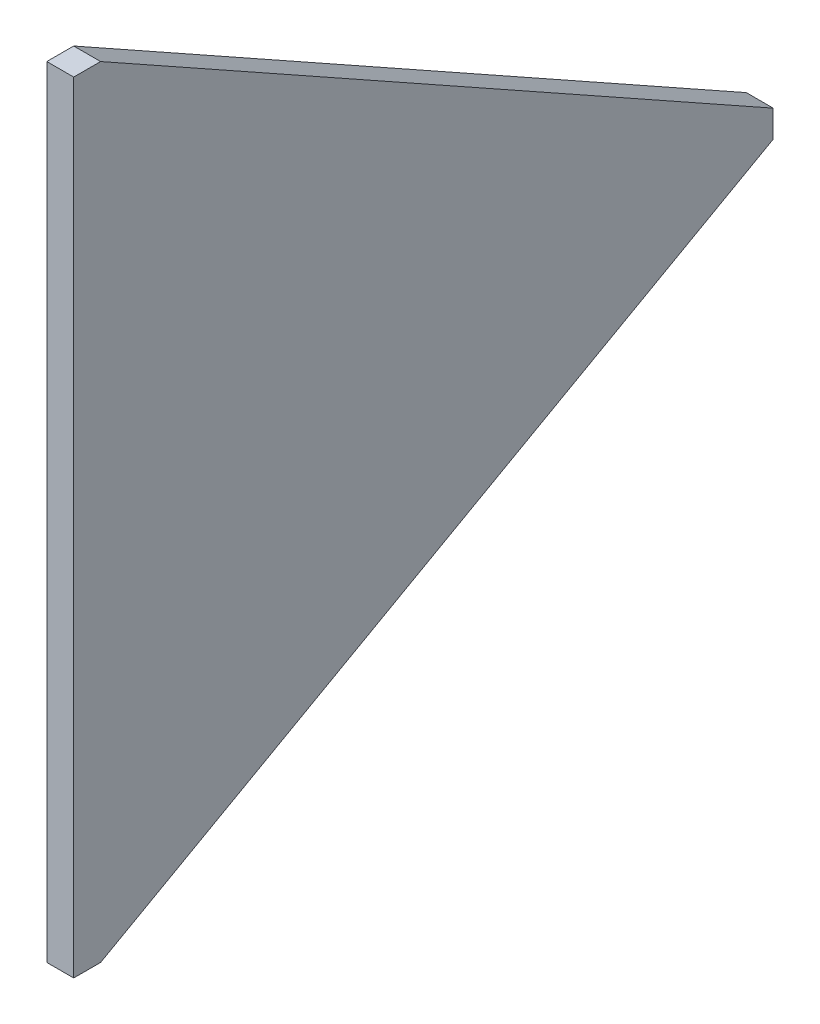
ISO-10303-21;
HEADER;
FILE_DESCRIPTION(('STEP AP214'),'2;1');
FILE_NAME('part.step','',(''),(''),'','','');
FILE_SCHEMA(('AUTOMOTIVE_DESIGN { 1 0 10303 214 1 1 1 1 }'));
ENDSEC;
DATA;
#1=APPLICATION_CONTEXT('core data for automotive mechanical design processes');
#2=APPLICATION_PROTOCOL_DEFINITION('international standard','automotive_design',2000,#1);
#3=PRODUCT_CONTEXT('',#1,'mechanical');
#4=PRODUCT('Part','Part','',(#3));
#5=PRODUCT_RELATED_PRODUCT_CATEGORY('part','',(#4));
#6=PRODUCT_DEFINITION_FORMATION('','',#4);
#7=PRODUCT_DEFINITION_CONTEXT('part definition',#1,'design');
#8=PRODUCT_DEFINITION('design','',#6,#7);
#9=PRODUCT_DEFINITION_SHAPE('','',#8);
#10=(LENGTH_UNIT() NAMED_UNIT(*) SI_UNIT(.MILLI.,.METRE.));
#11=(NAMED_UNIT(*) PLANE_ANGLE_UNIT() SI_UNIT($,.RADIAN.));
#12=(NAMED_UNIT(*) SI_UNIT($,.STERADIAN.) SOLID_ANGLE_UNIT());
#13=UNCERTAINTY_MEASURE_WITH_UNIT(LENGTH_MEASURE(1.E-05),#10,'distance_accuracy_value','');
#14=(GEOMETRIC_REPRESENTATION_CONTEXT(3) GLOBAL_UNCERTAINTY_ASSIGNED_CONTEXT((#13)) GLOBAL_UNIT_ASSIGNED_CONTEXT((#10,
#11,#12)) REPRESENTATION_CONTEXT('',''));
#15=CARTESIAN_POINT('',(0.,0.,0.));
#16=DIRECTION('',(0.,0.,1.));
#17=DIRECTION('',(1.,0.,0.));
#18=AXIS2_PLACEMENT_3D('',#15,#16,#17);
#19=CARTESIAN_POINT('',(2.,-29.,0.));
#20=DIRECTION('',(0.,1.,0.));
#21=DIRECTION('',(0.,0.,1.));
#22=AXIS2_PLACEMENT_3D('',#19,#20,#21);
#23=PLANE('',#22);
#24=DIRECTION('',(0.,0.,-1.));
#25=VECTOR('',#24,1.);
#26=CARTESIAN_POINT('',(0.,-29.,0.));
#27=LINE('',#26,#25);
#28=CARTESIAN_POINT('',(0.,-29.,0.));
#29=VERTEX_POINT('',#28);
#30=CARTESIAN_POINT('',(0.,-29.,-2.00000000000001));
#31=VERTEX_POINT('',#30);
#32=EDGE_CURVE('E128',#29,#31,#27,.T.);
#33=ORIENTED_EDGE('',*,*,#32,.T.);
#34=DIRECTION('',(-1.,0.,0.));
#35=VECTOR('',#34,1.);
#36=CARTESIAN_POINT('',(2.,-29.,-2.00000000000001));
#37=LINE('',#36,#35);
#38=CARTESIAN_POINT('',(2.,-29.,-2.00000000000001));
#39=VERTEX_POINT('',#38);
#40=EDGE_CURVE('E11',#39,#31,#37,.T.);
#41=ORIENTED_EDGE('',*,*,#40,.F.);
#42=DIRECTION('',(0.,0.,-1.));
#43=VECTOR('',#42,1.);
#44=CARTESIAN_POINT('',(2.,-29.,0.));
#45=LINE('',#44,#43);
#46=CARTESIAN_POINT('',(2.,-29.,0.));
#47=VERTEX_POINT('',#46);
#48=EDGE_CURVE('E144',#47,#39,#45,.T.);
#49=ORIENTED_EDGE('',*,*,#48,.F.);
#50=DIRECTION('',(-1.,0.,0.));
#51=VECTOR('',#50,1.);
#52=CARTESIAN_POINT('',(2.,-29.,0.));
#53=LINE('',#52,#51);
#54=EDGE_CURVE('E124',#47,#29,#53,.T.);
#55=ORIENTED_EDGE('',*,*,#54,.T.);
#56=EDGE_LOOP('',(#33,#41,#49,#55));
#57=FACE_BOUND('',#56,.T.);
#58=ADVANCED_FACE('F39',(#57),#23,.F.);
#59=CARTESIAN_POINT('',(2.,-29.,-2.00000000000001));
#60=DIRECTION('',(0.,0.87250601594972,0.488603368931843));
#61=DIRECTION('',(0.,-0.488603368931843,0.87250601594972));
#62=AXIS2_PLACEMENT_3D('',#59,#60,#61);
#63=PLANE('',#62);
#64=DIRECTION('',(0.,0.488603368931843,-0.87250601594972));
#65=VECTOR('',#64,1.);
#66=CARTESIAN_POINT('',(0.,-29.,-2.00000000000001));
#67=LINE('',#66,#65);
#68=CARTESIAN_POINT('',(0.,-1.,-52.));
#69=VERTEX_POINT('',#68);
#70=EDGE_CURVE('E132',#31,#69,#67,.T.);
#71=ORIENTED_EDGE('',*,*,#70,.T.);
#72=DIRECTION('',(-1.,0.,0.));
#73=VECTOR('',#72,1.);
#74=CARTESIAN_POINT('',(2.,-1.,-52.));
#75=LINE('',#74,#73);
#76=CARTESIAN_POINT('',(2.,-1.,-52.));
#77=VERTEX_POINT('',#76);
#78=EDGE_CURVE('E48',#77,#69,#75,.T.);
#79=ORIENTED_EDGE('',*,*,#78,.F.);
#80=DIRECTION('',(0.,0.488603368931843,-0.87250601594972));
#81=VECTOR('',#80,1.);
#82=CARTESIAN_POINT('',(2.,-29.,-2.00000000000001));
#83=LINE('',#82,#81);
#84=EDGE_CURVE('E93',#39,#77,#83,.T.);
#85=ORIENTED_EDGE('',*,*,#84,.F.);
#86=ORIENTED_EDGE('',*,*,#40,.T.);
#87=EDGE_LOOP('',(#71,#79,#85,#86));
#88=FACE_BOUND('',#87,.T.);
#89=ADVANCED_FACE('F172',(#88),#63,.F.);
#90=CARTESIAN_POINT('',(2.,-1.,-52.));
#91=DIRECTION('',(0.,0.,1.));
#92=DIRECTION('',(1.,0.,0.));
#93=AXIS2_PLACEMENT_3D('',#90,#91,#92);
#94=PLANE('',#93);
#95=DIRECTION('',(0.,1.,0.));
#96=VECTOR('',#95,1.);
#97=CARTESIAN_POINT('',(0.,-1.,-52.));
#98=LINE('',#97,#96);
#99=CARTESIAN_POINT('',(0.,1.,-52.));
#100=VERTEX_POINT('',#99);
#101=EDGE_CURVE('E135',#69,#100,#98,.T.);
#102=ORIENTED_EDGE('',*,*,#101,.T.);
#103=DIRECTION('',(-1.,0.,0.));
#104=VECTOR('',#103,1.);
#105=CARTESIAN_POINT('',(2.,1.,-52.));
#106=LINE('',#105,#104);
#107=CARTESIAN_POINT('',(2.,1.,-52.));
#108=VERTEX_POINT('',#107);
#109=EDGE_CURVE('E117',#108,#100,#106,.T.);
#110=ORIENTED_EDGE('',*,*,#109,.F.);
#111=DIRECTION('',(0.,1.,0.));
#112=VECTOR('',#111,1.);
#113=CARTESIAN_POINT('',(2.,-1.,-52.));
#114=LINE('',#113,#112);
#115=EDGE_CURVE('E106',#77,#108,#114,.T.);
#116=ORIENTED_EDGE('',*,*,#115,.F.);
#117=ORIENTED_EDGE('',*,*,#78,.T.);
#118=EDGE_LOOP('',(#102,#110,#116,#117));
#119=FACE_BOUND('',#118,.T.);
#120=ADVANCED_FACE('F154',(#119),#94,.F.);
#121=CARTESIAN_POINT('',(2.,1.,-52.));
#122=DIRECTION('',(0.,-0.87250601594972,0.488603368931843));
#123=DIRECTION('',(0.,-0.488603368931843,-0.87250601594972));
#124=AXIS2_PLACEMENT_3D('',#121,#122,#123);
#125=PLANE('',#124);
#126=DIRECTION('',(0.,0.488603368931843,0.87250601594972));
#127=VECTOR('',#126,1.);
#128=CARTESIAN_POINT('',(0.,1.,-52.));
#129=LINE('',#128,#127);
#130=CARTESIAN_POINT('',(0.,29.,-1.99999999999999));
#131=VERTEX_POINT('',#130);
#132=EDGE_CURVE('E115',#100,#131,#129,.T.);
#133=ORIENTED_EDGE('',*,*,#132,.T.);
#134=DIRECTION('',(-1.,0.,0.));
#135=VECTOR('',#134,1.);
#136=CARTESIAN_POINT('',(2.,29.,-1.99999999999999));
#137=LINE('',#136,#135);
#138=CARTESIAN_POINT('',(2.,29.,-1.99999999999999));
#139=VERTEX_POINT('',#138);
#140=EDGE_CURVE('E112',#139,#131,#137,.T.);
#141=ORIENTED_EDGE('',*,*,#140,.F.);
#142=DIRECTION('',(0.,0.488603368931843,0.87250601594972));
#143=VECTOR('',#142,1.);
#144=CARTESIAN_POINT('',(2.,1.,-52.));
#145=LINE('',#144,#143);
#146=EDGE_CURVE('E100',#108,#139,#145,.T.);
#147=ORIENTED_EDGE('',*,*,#146,.F.);
#148=ORIENTED_EDGE('',*,*,#109,.T.);
#149=EDGE_LOOP('',(#133,#141,#147,#148));
#150=FACE_BOUND('',#149,.T.);
#151=ADVANCED_FACE('F113',(#150),#125,.F.);
#152=CARTESIAN_POINT('',(2.,29.,-1.99999999999999));
#153=DIRECTION('',(0.,-1.,0.));
#154=DIRECTION('',(0.,0.,-1.));
#155=AXIS2_PLACEMENT_3D('',#152,#153,#154);
#156=PLANE('',#155);
#157=DIRECTION('',(0.,0.,1.));
#158=VECTOR('',#157,1.);
#159=CARTESIAN_POINT('',(0.,29.,-1.99999999999999));
#160=LINE('',#159,#158);
#161=CARTESIAN_POINT('',(0.,29.,0.));
#162=VERTEX_POINT('',#161);
#163=EDGE_CURVE('E79',#131,#162,#160,.T.);
#164=ORIENTED_EDGE('',*,*,#163,.T.);
#165=DIRECTION('',(-1.,0.,0.));
#166=VECTOR('',#165,1.);
#167=CARTESIAN_POINT('',(2.,29.,0.));
#168=LINE('',#167,#166);
#169=CARTESIAN_POINT('',(2.,29.,0.));
#170=VERTEX_POINT('',#169);
#171=EDGE_CURVE('E118',#170,#162,#168,.T.);
#172=ORIENTED_EDGE('',*,*,#171,.F.);
#173=DIRECTION('',(0.,0.,1.));
#174=VECTOR('',#173,1.);
#175=CARTESIAN_POINT('',(2.,29.,-1.99999999999999));
#176=LINE('',#175,#174);
#177=EDGE_CURVE('E104',#139,#170,#176,.T.);
#178=ORIENTED_EDGE('',*,*,#177,.F.);
#179=ORIENTED_EDGE('',*,*,#140,.T.);
#180=EDGE_LOOP('',(#164,#172,#178,#179));
#181=FACE_BOUND('',#180,.T.);
#182=ADVANCED_FACE('F120',(#181),#156,.F.);
#183=CARTESIAN_POINT('',(2.,29.,0.));
#184=DIRECTION('',(0.,0.,-1.));
#185=DIRECTION('',(0.,1.,0.));
#186=AXIS2_PLACEMENT_3D('',#183,#184,#185);
#187=PLANE('',#186);
#188=DIRECTION('',(0.,-1.,0.));
#189=VECTOR('',#188,1.);
#190=CARTESIAN_POINT('',(0.,29.,0.));
#191=LINE('',#190,#189);
#192=EDGE_CURVE('E85',#162,#29,#191,.T.);
#193=ORIENTED_EDGE('',*,*,#192,.T.);
#194=ORIENTED_EDGE('',*,*,#54,.F.);
#195=DIRECTION('',(0.,-1.,0.));
#196=VECTOR('',#195,1.);
#197=CARTESIAN_POINT('',(2.,29.,0.));
#198=LINE('',#197,#196);
#199=EDGE_CURVE('E56',#170,#47,#198,.T.);
#200=ORIENTED_EDGE('',*,*,#199,.F.);
#201=ORIENTED_EDGE('',*,*,#171,.T.);
#202=EDGE_LOOP('',(#193,#194,#200,#201));
#203=FACE_BOUND('',#202,.T.);
#204=ADVANCED_FACE('F161',(#203),#187,.F.);
#205=CARTESIAN_POINT('',(2.,0.,0.));
#206=DIRECTION('',(1.,0.,0.));
#207=DIRECTION('',(0.,0.,-1.));
#208=AXIS2_PLACEMENT_3D('',#205,#206,#207);
#209=PLANE('',#208);
#210=ORIENTED_EDGE('',*,*,#48,.T.);
#211=ORIENTED_EDGE('',*,*,#84,.T.);
#212=ORIENTED_EDGE('',*,*,#115,.T.);
#213=ORIENTED_EDGE('',*,*,#146,.T.);
#214=ORIENTED_EDGE('',*,*,#177,.T.);
#215=ORIENTED_EDGE('',*,*,#199,.T.);
#216=EDGE_LOOP('',(#210,#211,#212,#213,#214,#215));
#217=FACE_BOUND('',#216,.T.);
#218=ADVANCED_FACE('F102',(#217),#209,.T.);
#219=CARTESIAN_POINT('',(0.,0.,0.));
#220=DIRECTION('',(1.,0.,0.));
#221=DIRECTION('',(0.,0.,-1.));
#222=AXIS2_PLACEMENT_3D('',#219,#220,#221);
#223=PLANE('',#222);
#224=ORIENTED_EDGE('',*,*,#32,.F.);
#225=ORIENTED_EDGE('',*,*,#192,.F.);
#226=ORIENTED_EDGE('',*,*,#163,.F.);
#227=ORIENTED_EDGE('',*,*,#132,.F.);
#228=ORIENTED_EDGE('',*,*,#101,.F.);
#229=ORIENTED_EDGE('',*,*,#70,.F.);
#230=EDGE_LOOP('',(#224,#225,#226,#227,#228,#229));
#231=FACE_BOUND('',#230,.T.);
#232=ADVANCED_FACE('F157',(#231),#223,.F.);
#233=CLOSED_SHELL('',(#58,#89,#120,#151,#182,#204,#218,#232));
#234=MANIFOLD_SOLID_BREP('B2',#233);
#235=ADVANCED_BREP_SHAPE_REPRESENTATION('',(#18,#234),#14);
#236=SHAPE_DEFINITION_REPRESENTATION(#9,#235);
ENDSEC;
END-ISO-10303-21;
